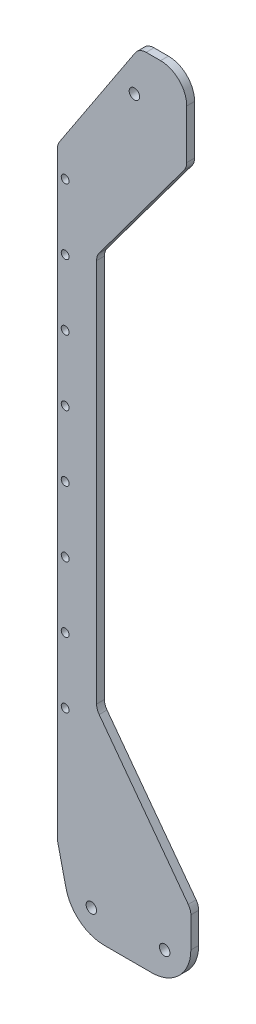
ISO-10303-21;
HEADER;
FILE_DESCRIPTION(('STEP AP214'),'2;1');
FILE_NAME('part.step','',(''),(''),'','','');
FILE_SCHEMA(('AUTOMOTIVE_DESIGN { 1 0 10303 214 1 1 1 1 }'));
ENDSEC;
DATA;
#1=APPLICATION_CONTEXT('core data for automotive mechanical design processes');
#2=APPLICATION_PROTOCOL_DEFINITION('international standard','automotive_design',2000,#1);
#3=PRODUCT_CONTEXT('',#1,'mechanical');
#4=PRODUCT('Part','Part','',(#3));
#5=PRODUCT_RELATED_PRODUCT_CATEGORY('part','',(#4));
#6=PRODUCT_DEFINITION_FORMATION('','',#4);
#7=PRODUCT_DEFINITION_CONTEXT('part definition',#1,'design');
#8=PRODUCT_DEFINITION('design','',#6,#7);
#9=PRODUCT_DEFINITION_SHAPE('','',#8);
#10=(LENGTH_UNIT() NAMED_UNIT(*) SI_UNIT(.MILLI.,.METRE.));
#11=(NAMED_UNIT(*) PLANE_ANGLE_UNIT() SI_UNIT($,.RADIAN.));
#12=(NAMED_UNIT(*) SI_UNIT($,.STERADIAN.) SOLID_ANGLE_UNIT());
#13=UNCERTAINTY_MEASURE_WITH_UNIT(LENGTH_MEASURE(1.E-05),#10,'distance_accuracy_value','');
#14=(GEOMETRIC_REPRESENTATION_CONTEXT(3) GLOBAL_UNCERTAINTY_ASSIGNED_CONTEXT((#13)) GLOBAL_UNIT_ASSIGNED_CONTEXT((#10,
#11,#12)) REPRESENTATION_CONTEXT('',''));
#15=CARTESIAN_POINT('',(0.,0.,0.));
#16=DIRECTION('',(0.,0.,1.));
#17=DIRECTION('',(1.,0.,0.));
#18=AXIS2_PLACEMENT_3D('',#15,#16,#17);
#19=CARTESIAN_POINT('',(0.,0.,3.));
#20=DIRECTION('',(0.,0.,1.));
#21=DIRECTION('',(1.,0.,0.));
#22=AXIS2_PLACEMENT_3D('',#19,#20,#21);
#23=PLANE('',#22);
#24=CARTESIAN_POINT('',(-12.,246.,3.));
#25=DIRECTION('',(0.,0.,1.));
#26=DIRECTION('',(1.,0.,0.));
#27=AXIS2_PLACEMENT_3D('',#24,#25,#26);
#28=CIRCLE('',#27,1.5);
#29=CARTESIAN_POINT('',(-10.5,246.,3.));
#30=VERTEX_POINT('',#29);
#31=EDGE_CURVE('E728',#30,#30,#28,.T.);
#32=ORIENTED_EDGE('',*,*,#31,.F.);
#33=EDGE_LOOP('',(#32));
#34=FACE_BOUND('',#33,.T.);
#35=CARTESIAN_POINT('',(-12.,221.,3.));
#36=DIRECTION('',(0.,0.,1.));
#37=DIRECTION('',(1.,0.,0.));
#38=AXIS2_PLACEMENT_3D('',#35,#36,#37);
#39=CIRCLE('',#38,1.5);
#40=CARTESIAN_POINT('',(-10.5,221.,3.));
#41=VERTEX_POINT('',#40);
#42=EDGE_CURVE('E775',#41,#41,#39,.T.);
#43=ORIENTED_EDGE('',*,*,#42,.F.);
#44=EDGE_LOOP('',(#43));
#45=FACE_BOUND('',#44,.T.);
#46=CARTESIAN_POINT('',(-12.,196.,3.));
#47=DIRECTION('',(0.,0.,1.));
#48=DIRECTION('',(1.,0.,0.));
#49=AXIS2_PLACEMENT_3D('',#46,#47,#48);
#50=CIRCLE('',#49,1.5);
#51=CARTESIAN_POINT('',(-10.5,196.,3.));
#52=VERTEX_POINT('',#51);
#53=EDGE_CURVE('E766',#52,#52,#50,.T.);
#54=ORIENTED_EDGE('',*,*,#53,.F.);
#55=EDGE_LOOP('',(#54));
#56=FACE_BOUND('',#55,.T.);
#57=CARTESIAN_POINT('',(-12.,171.,3.));
#58=DIRECTION('',(0.,0.,1.));
#59=DIRECTION('',(1.,0.,0.));
#60=AXIS2_PLACEMENT_3D('',#57,#58,#59);
#61=CIRCLE('',#60,1.5);
#62=CARTESIAN_POINT('',(-10.5,171.,3.));
#63=VERTEX_POINT('',#62);
#64=EDGE_CURVE('E759',#63,#63,#61,.T.);
#65=ORIENTED_EDGE('',*,*,#64,.F.);
#66=EDGE_LOOP('',(#65));
#67=FACE_BOUND('',#66,.T.);
#68=CARTESIAN_POINT('',(-12.,146.,3.));
#69=DIRECTION('',(0.,0.,1.));
#70=DIRECTION('',(1.,0.,0.));
#71=AXIS2_PLACEMENT_3D('',#68,#69,#70);
#72=CIRCLE('',#71,1.5);
#73=CARTESIAN_POINT('',(-10.5,146.,3.));
#74=VERTEX_POINT('',#73);
#75=EDGE_CURVE('E754',#74,#74,#72,.T.);
#76=ORIENTED_EDGE('',*,*,#75,.F.);
#77=EDGE_LOOP('',(#76));
#78=FACE_BOUND('',#77,.T.);
#79=CARTESIAN_POINT('',(-12.,121.,3.));
#80=DIRECTION('',(0.,0.,1.));
#81=DIRECTION('',(1.,0.,0.));
#82=AXIS2_PLACEMENT_3D('',#79,#80,#81);
#83=CIRCLE('',#82,1.5);
#84=CARTESIAN_POINT('',(-10.5,121.,3.));
#85=VERTEX_POINT('',#84);
#86=EDGE_CURVE('E746',#85,#85,#83,.T.);
#87=ORIENTED_EDGE('',*,*,#86,.F.);
#88=EDGE_LOOP('',(#87));
#89=FACE_BOUND('',#88,.T.);
#90=CARTESIAN_POINT('',(-12.,96.,3.));
#91=DIRECTION('',(0.,0.,1.));
#92=DIRECTION('',(1.,0.,0.));
#93=AXIS2_PLACEMENT_3D('',#90,#91,#92);
#94=CIRCLE('',#93,1.5);
#95=CARTESIAN_POINT('',(-10.5,96.,3.));
#96=VERTEX_POINT('',#95);
#97=EDGE_CURVE('E745',#96,#96,#94,.T.);
#98=ORIENTED_EDGE('',*,*,#97,.F.);
#99=EDGE_LOOP('',(#98));
#100=FACE_BOUND('',#99,.T.);
#101=CARTESIAN_POINT('',(-12.,71.,3.));
#102=DIRECTION('',(0.,0.,1.));
#103=DIRECTION('',(1.,0.,0.));
#104=AXIS2_PLACEMENT_3D('',#101,#102,#103);
#105=CIRCLE('',#104,1.5);
#106=CARTESIAN_POINT('',(-10.5,71.,3.));
#107=VERTEX_POINT('',#106);
#108=EDGE_CURVE('E738',#107,#107,#105,.T.);
#109=ORIENTED_EDGE('',*,*,#108,.F.);
#110=EDGE_LOOP('',(#109));
#111=FACE_BOUND('',#110,.T.);
#112=CARTESIAN_POINT('',(14.4368280116076,287.4052901571,3.));
#113=DIRECTION('',(0.,0.,1.));
#114=DIRECTION('',(-1.,0.,0.));
#115=AXIS2_PLACEMENT_3D('',#112,#113,#114);
#116=CIRCLE('',#115,2.00000000000004);
#117=CARTESIAN_POINT('',(12.4368280116075,287.4052901571,3.));
#118=VERTEX_POINT('',#117);
#119=EDGE_CURVE('E468',#118,#118,#116,.T.);
#120=ORIENTED_EDGE('',*,*,#119,.F.);
#121=EDGE_LOOP('',(#120));
#122=FACE_BOUND('',#121,.T.);
#123=DIRECTION('',(0.,1.,0.));
#124=VECTOR('',#123,1.);
#125=CARTESIAN_POINT('',(34.4368280116076,273.032399522689,3.));
#126=LINE('',#125,#124);
#127=CARTESIAN_POINT('',(34.4368280116076,274.687122239053,3.));
#128=VERTEX_POINT('',#127);
#129=CARTESIAN_POINT('',(34.4368280116076,293.4052901571,3.));
#130=VERTEX_POINT('',#129);
#131=EDGE_CURVE('E339',#128,#130,#126,.T.);
#132=ORIENTED_EDGE('',*,*,#131,.T.);
#133=CARTESIAN_POINT('',(24.4368280116076,293.4052901571,3.));
#134=DIRECTION('',(0.,0.,1.));
#135=DIRECTION('',(1.,0.,0.));
#136=AXIS2_PLACEMENT_3D('',#133,#134,#135);
#137=CIRCLE('',#136,10.);
#138=CARTESIAN_POINT('',(24.4368280116076,303.4052901571,3.));
#139=VERTEX_POINT('',#138);
#140=EDGE_CURVE('E11',#130,#139,#137,.T.);
#141=ORIENTED_EDGE('',*,*,#140,.T.);
#142=DIRECTION('',(-1.,0.,0.));
#143=VECTOR('',#142,1.);
#144=CARTESIAN_POINT('',(34.4368280116076,303.4052901571,3.));
#145=LINE('',#144,#143);
#146=CARTESIAN_POINT('',(18.9256887557333,303.4052901571,3.));
#147=VERTEX_POINT('',#146);
#148=EDGE_CURVE('E320',#139,#147,#145,.T.);
#149=ORIENTED_EDGE('',*,*,#148,.T.);
#150=CARTESIAN_POINT('',(18.9256887557333,298.4052901571,3.));
#151=DIRECTION('',(0.,0.,1.));
#152=DIRECTION('',(1.,0.,0.));
#153=AXIS2_PLACEMENT_3D('',#150,#151,#152);
#154=CIRCLE('',#153,5.);
#155=CARTESIAN_POINT('',(14.7504059798159,301.156110714884,3.));
#156=VERTEX_POINT('',#155);
#157=EDGE_CURVE('E268',#147,#156,#154,.T.);
#158=ORIENTED_EDGE('',*,*,#157,.T.);
#159=DIRECTION('',(-0.550164111556811,-0.835056555183483,0.));
#160=VECTOR('',#159,1.);
#161=CARTESIAN_POINT('',(16.2322431103402,303.4052901571,3.));
#162=LINE('',#161,#160);
#163=CARTESIAN_POINT('',(-14.1752827759174,257.251781985913,3.));
#164=VERTEX_POINT('',#163);
#165=EDGE_CURVE('E327',#156,#164,#162,.T.);
#166=ORIENTED_EDGE('',*,*,#165,.T.);
#167=CARTESIAN_POINT('',(-10.,254.500961428129,3.));
#168=DIRECTION('',(0.,0.,1.));
#169=DIRECTION('',(1.,0.,0.));
#170=AXIS2_PLACEMENT_3D('',#167,#168,#169);
#171=CIRCLE('',#170,5.);
#172=CARTESIAN_POINT('',(-15.,254.500961428129,3.));
#173=VERTEX_POINT('',#172);
#174=EDGE_CURVE('E266',#164,#173,#171,.T.);
#175=ORIENTED_EDGE('',*,*,#174,.T.);
#176=DIRECTION('',(0.,-1.,0.));
#177=VECTOR('',#176,1.);
#178=CARTESIAN_POINT('',(-15.,256.,3.));
#179=LINE('',#178,#177);
#180=CARTESIAN_POINT('',(-15.0000000000001,26.5694401068772,3.));
#181=VERTEX_POINT('',#180);
#182=EDGE_CURVE('E331',#173,#181,#179,.T.);
#183=ORIENTED_EDGE('',*,*,#182,.T.);
#184=CARTESIAN_POINT('',(-10.0000000000001,26.5694401068772,3.));
#185=DIRECTION('',(0.,0.,1.));
#186=DIRECTION('',(1.,0.,0.));
#187=AXIS2_PLACEMENT_3D('',#184,#185,#186);
#188=CIRCLE('',#187,5.);
#189=CARTESIAN_POINT('',(-14.8719559784732,25.4451425733834,3.));
#190=VERTEX_POINT('',#189);
#191=EDGE_CURVE('E275',#181,#190,#188,.T.);
#192=ORIENTED_EDGE('',*,*,#191,.T.);
#193=DIRECTION('',(0.224859506698758,-0.97439119569462,0.));
#194=VECTOR('',#193,1.);
#195=CARTESIAN_POINT('',(-15.0000000000001,26.,3.));
#196=LINE('',#195,#194);
#197=CARTESIAN_POINT('',(-11.6831786306582,11.6271073995186,3.));
#198=VERTEX_POINT('',#197);
#199=EDGE_CURVE('E197',#190,#198,#196,.T.);
#200=ORIENTED_EDGE('',*,*,#199,.T.);
#201=CARTESIAN_POINT('',(2.93268930476107,15.,3.));
#202=DIRECTION('',(0.,0.,1.));
#203=DIRECTION('',(1.,0.,0.));
#204=AXIS2_PLACEMENT_3D('',#201,#202,#203);
#205=CIRCLE('',#204,15.);
#206=CARTESIAN_POINT('',(2.93268930476107,0.,3.));
#207=VERTEX_POINT('',#206);
#208=EDGE_CURVE('E237',#198,#207,#205,.T.);
#209=ORIENTED_EDGE('',*,*,#208,.T.);
#210=DIRECTION('',(1.,0.,0.));
#211=VECTOR('',#210,1.);
#212=CARTESIAN_POINT('',(-9.00000000000008,0.,3.));
#213=LINE('',#212,#211);
#214=CARTESIAN_POINT('',(21.,0.,3.));
#215=VERTEX_POINT('',#214);
#216=EDGE_CURVE('E235',#207,#215,#213,.T.);
#217=ORIENTED_EDGE('',*,*,#216,.T.);
#218=CARTESIAN_POINT('',(21.,15.,3.));
#219=DIRECTION('',(0.,0.,1.));
#220=DIRECTION('',(1.,0.,0.));
#221=AXIS2_PLACEMENT_3D('',#218,#219,#220);
#222=CIRCLE('',#221,15.);
#223=CARTESIAN_POINT('',(36.,15.,3.));
#224=VERTEX_POINT('',#223);
#225=EDGE_CURVE('E241',#215,#224,#222,.T.);
#226=ORIENTED_EDGE('',*,*,#225,.T.);
#227=DIRECTION('',(0.,1.,0.));
#228=VECTOR('',#227,1.);
#229=CARTESIAN_POINT('',(36.,0.,3.));
#230=LINE('',#229,#228);
#231=CARTESIAN_POINT('',(36.,26.6151468630369,3.));
#232=VERTEX_POINT('',#231);
#233=EDGE_CURVE('E199',#224,#232,#230,.T.);
#234=ORIENTED_EDGE('',*,*,#233,.T.);
#235=CARTESIAN_POINT('',(31.,26.6151468630369,3.));
#236=DIRECTION('',(0.,0.,1.));
#237=DIRECTION('',(1.,0.,0.));
#238=AXIS2_PLACEMENT_3D('',#235,#236,#237);
#239=CIRCLE('',#238,5.);
#240=CARTESIAN_POINT('',(35.0128716276162,29.5979075474152,3.));
#241=VERTEX_POINT('',#240);
#242=EDGE_CURVE('E264',#232,#241,#239,.T.);
#243=ORIENTED_EDGE('',*,*,#242,.T.);
#244=DIRECTION('',(-0.596552136875664,0.802574325523237,0.));
#245=VECTOR('',#244,1.);
#246=CARTESIAN_POINT('',(36.,28.2698695794012,3.));
#247=LINE('',#246,#245);
#248=CARTESIAN_POINT('',(0.987128372383808,75.374607110536,3.));
#249=VERTEX_POINT('',#248);
#250=EDGE_CURVE('E489',#241,#249,#247,.T.);
#251=ORIENTED_EDGE('',*,*,#250,.T.);
#252=CARTESIAN_POINT('',(5.,78.3573677949143,3.));
#253=DIRECTION('',(0.,0.,1.));
#254=DIRECTION('',(1.,0.,0.));
#255=AXIS2_PLACEMENT_3D('',#252,#253,#254);
#256=CIRCLE('',#255,5.);
#257=CARTESIAN_POINT('',(0.,78.3573677949143,3.));
#258=VERTEX_POINT('',#257);
#259=EDGE_CURVE('E308',#249,#258,#256,.F.);
#260=ORIENTED_EDGE('',*,*,#259,.T.);
#261=DIRECTION('',(0.,1.,0.));
#262=VECTOR('',#261,1.);
#263=CARTESIAN_POINT('',(0.,76.70264507855,3.));
#264=LINE('',#263,#262);
#265=CARTESIAN_POINT('',(0.,225.047922362186,3.));
#266=VERTEX_POINT('',#265);
#267=EDGE_CURVE('E491',#258,#266,#264,.T.);
#268=ORIENTED_EDGE('',*,*,#267,.T.);
#269=CARTESIAN_POINT('',(5.,225.047922362186,3.));
#270=DIRECTION('',(0.,0.,1.));
#271=DIRECTION('',(1.,0.,0.));
#272=AXIS2_PLACEMENT_3D('',#269,#270,#271);
#273=CIRCLE('',#272,5.);
#274=CARTESIAN_POINT('',(0.987128372383809,228.030683046564,3.));
#275=VERTEX_POINT('',#274);
#276=EDGE_CURVE('E302',#266,#275,#273,.F.);
#277=ORIENTED_EDGE('',*,*,#276,.T.);
#278=DIRECTION('',(0.596552136875664,0.802574325523237,0.));
#279=VECTOR('',#278,1.);
#280=CARTESIAN_POINT('',(0.,226.70264507855,3.));
#281=LINE('',#280,#279);
#282=CARTESIAN_POINT('',(33.4496996392238,271.704361554675,3.));
#283=VERTEX_POINT('',#282);
#284=EDGE_CURVE('E496',#275,#283,#281,.T.);
#285=ORIENTED_EDGE('',*,*,#284,.T.);
#286=CARTESIAN_POINT('',(29.4368280116076,274.687122239053,3.));
#287=DIRECTION('',(0.,0.,1.));
#288=DIRECTION('',(1.,0.,0.));
#289=AXIS2_PLACEMENT_3D('',#286,#287,#288);
#290=CIRCLE('',#289,5.);
#291=EDGE_CURVE('E267',#283,#128,#290,.T.);
#292=ORIENTED_EDGE('',*,*,#291,.T.);
#293=EDGE_LOOP('',(#132,#141,#149,#158,#166,#175,#183,#192,#200,#209,#217,#226,#234,#243,#251,
#260,#268,#277,#285,#292));
#294=FACE_BOUND('',#293,.T.);
#295=CARTESIAN_POINT('',(26.,10.,3.));
#296=DIRECTION('',(0.,0.,1.));
#297=DIRECTION('',(1.,0.,0.));
#298=AXIS2_PLACEMENT_3D('',#295,#296,#297);
#299=CIRCLE('',#298,2.);
#300=CARTESIAN_POINT('',(28.,10.,3.));
#301=VERTEX_POINT('',#300);
#302=EDGE_CURVE('E215',#301,#301,#299,.T.);
#303=ORIENTED_EDGE('',*,*,#302,.F.);
#304=EDGE_LOOP('',(#303));
#305=FACE_BOUND('',#304,.T.);
#306=CARTESIAN_POINT('',(-2.00000000000008,10.,3.));
#307=DIRECTION('',(0.,0.,1.));
#308=DIRECTION('',(1.,0.,0.));
#309=AXIS2_PLACEMENT_3D('',#306,#307,#308);
#310=CIRCLE('',#309,2.);
#311=CARTESIAN_POINT('',(0.,10.,3.));
#312=VERTEX_POINT('',#311);
#313=EDGE_CURVE('E474',#312,#312,#310,.T.);
#314=ORIENTED_EDGE('',*,*,#313,.F.);
#315=EDGE_LOOP('',(#314));
#316=FACE_BOUND('',#315,.T.);
#317=ADVANCED_FACE('F43',(#34,#45,#56,#67,#78,#89,#100,#111,#122,#294,#305,#316),#23,.T.);
#318=CARTESIAN_POINT('',(0.,0.,0.));
#319=DIRECTION('',(0.,0.,1.));
#320=DIRECTION('',(1.,0.,0.));
#321=AXIS2_PLACEMENT_3D('',#318,#319,#320);
#322=PLANE('',#321);
#323=CARTESIAN_POINT('',(-12.,246.,0.));
#324=DIRECTION('',(0.,0.,1.));
#325=DIRECTION('',(1.,0.,0.));
#326=AXIS2_PLACEMENT_3D('',#323,#324,#325);
#327=CIRCLE('',#326,1.5);
#328=CARTESIAN_POINT('',(-10.5,246.,0.));
#329=VERTEX_POINT('',#328);
#330=EDGE_CURVE('E726',#329,#329,#327,.T.);
#331=ORIENTED_EDGE('',*,*,#330,.T.);
#332=EDGE_LOOP('',(#331));
#333=FACE_BOUND('',#332,.T.);
#334=CARTESIAN_POINT('',(-12.,221.,0.));
#335=DIRECTION('',(0.,0.,1.));
#336=DIRECTION('',(1.,0.,0.));
#337=AXIS2_PLACEMENT_3D('',#334,#335,#336);
#338=CIRCLE('',#337,1.5);
#339=CARTESIAN_POINT('',(-10.5,221.,0.));
#340=VERTEX_POINT('',#339);
#341=EDGE_CURVE('E768',#340,#340,#338,.T.);
#342=ORIENTED_EDGE('',*,*,#341,.T.);
#343=EDGE_LOOP('',(#342));
#344=FACE_BOUND('',#343,.T.);
#345=CARTESIAN_POINT('',(-12.,196.,0.));
#346=DIRECTION('',(0.,0.,1.));
#347=DIRECTION('',(1.,0.,0.));
#348=AXIS2_PLACEMENT_3D('',#345,#346,#347);
#349=CIRCLE('',#348,1.5);
#350=CARTESIAN_POINT('',(-10.5,196.,0.));
#351=VERTEX_POINT('',#350);
#352=EDGE_CURVE('E763',#351,#351,#349,.T.);
#353=ORIENTED_EDGE('',*,*,#352,.T.);
#354=EDGE_LOOP('',(#353));
#355=FACE_BOUND('',#354,.T.);
#356=CARTESIAN_POINT('',(-12.,171.,0.));
#357=DIRECTION('',(0.,0.,1.));
#358=DIRECTION('',(1.,0.,0.));
#359=AXIS2_PLACEMENT_3D('',#356,#357,#358);
#360=CIRCLE('',#359,1.5);
#361=CARTESIAN_POINT('',(-10.5,171.,0.));
#362=VERTEX_POINT('',#361);
#363=EDGE_CURVE('E760',#362,#362,#360,.T.);
#364=ORIENTED_EDGE('',*,*,#363,.T.);
#365=EDGE_LOOP('',(#364));
#366=FACE_BOUND('',#365,.T.);
#367=CARTESIAN_POINT('',(-12.,146.,0.));
#368=DIRECTION('',(0.,0.,1.));
#369=DIRECTION('',(1.,0.,0.));
#370=AXIS2_PLACEMENT_3D('',#367,#368,#369);
#371=CIRCLE('',#370,1.5);
#372=CARTESIAN_POINT('',(-10.5,146.,0.));
#373=VERTEX_POINT('',#372);
#374=EDGE_CURVE('E753',#373,#373,#371,.T.);
#375=ORIENTED_EDGE('',*,*,#374,.T.);
#376=EDGE_LOOP('',(#375));
#377=FACE_BOUND('',#376,.T.);
#378=CARTESIAN_POINT('',(-12.,121.,0.));
#379=DIRECTION('',(0.,0.,1.));
#380=DIRECTION('',(1.,0.,0.));
#381=AXIS2_PLACEMENT_3D('',#378,#379,#380);
#382=CIRCLE('',#381,1.5);
#383=CARTESIAN_POINT('',(-10.5,121.,0.));
#384=VERTEX_POINT('',#383);
#385=EDGE_CURVE('E741',#384,#384,#382,.T.);
#386=ORIENTED_EDGE('',*,*,#385,.T.);
#387=EDGE_LOOP('',(#386));
#388=FACE_BOUND('',#387,.T.);
#389=CARTESIAN_POINT('',(-12.,96.,0.));
#390=DIRECTION('',(0.,0.,1.));
#391=DIRECTION('',(1.,0.,0.));
#392=AXIS2_PLACEMENT_3D('',#389,#390,#391);
#393=CIRCLE('',#392,1.5);
#394=CARTESIAN_POINT('',(-10.5,96.,0.));
#395=VERTEX_POINT('',#394);
#396=EDGE_CURVE('E739',#395,#395,#393,.T.);
#397=ORIENTED_EDGE('',*,*,#396,.T.);
#398=EDGE_LOOP('',(#397));
#399=FACE_BOUND('',#398,.T.);
#400=CARTESIAN_POINT('',(-12.,71.,0.));
#401=DIRECTION('',(0.,0.,1.));
#402=DIRECTION('',(1.,0.,0.));
#403=AXIS2_PLACEMENT_3D('',#400,#401,#402);
#404=CIRCLE('',#403,1.5);
#405=CARTESIAN_POINT('',(-10.5,71.,0.));
#406=VERTEX_POINT('',#405);
#407=EDGE_CURVE('E732',#406,#406,#404,.T.);
#408=ORIENTED_EDGE('',*,*,#407,.T.);
#409=EDGE_LOOP('',(#408));
#410=FACE_BOUND('',#409,.T.);
#411=DIRECTION('',(-1.,0.,0.));
#412=VECTOR('',#411,1.);
#413=CARTESIAN_POINT('',(34.4368280116076,303.4052901571,0.));
#414=LINE('',#413,#412);
#415=CARTESIAN_POINT('',(24.4368280116076,303.4052901571,0.));
#416=VERTEX_POINT('',#415);
#417=CARTESIAN_POINT('',(18.9256887557333,303.4052901571,0.));
#418=VERTEX_POINT('',#417);
#419=EDGE_CURVE('E223',#416,#418,#414,.T.);
#420=ORIENTED_EDGE('',*,*,#419,.F.);
#421=CARTESIAN_POINT('',(24.4368280116076,293.4052901571,0.));
#422=DIRECTION('',(0.,0.,1.));
#423=DIRECTION('',(1.,0.,0.));
#424=AXIS2_PLACEMENT_3D('',#421,#422,#423);
#425=CIRCLE('',#424,10.);
#426=CARTESIAN_POINT('',(34.4368280116076,293.4052901571,0.));
#427=VERTEX_POINT('',#426);
#428=EDGE_CURVE('E64',#416,#427,#425,.F.);
#429=ORIENTED_EDGE('',*,*,#428,.T.);
#430=DIRECTION('',(0.,1.,0.));
#431=VECTOR('',#430,1.);
#432=CARTESIAN_POINT('',(34.4368280116076,273.032399522689,0.));
#433=LINE('',#432,#431);
#434=CARTESIAN_POINT('',(34.4368280116076,274.687122239053,0.));
#435=VERTEX_POINT('',#434);
#436=EDGE_CURVE('E222',#435,#427,#433,.T.);
#437=ORIENTED_EDGE('',*,*,#436,.F.);
#438=CARTESIAN_POINT('',(29.4368280116076,274.687122239053,0.));
#439=DIRECTION('',(0.,0.,1.));
#440=DIRECTION('',(1.,0.,0.));
#441=AXIS2_PLACEMENT_3D('',#438,#439,#440);
#442=CIRCLE('',#441,5.);
#443=CARTESIAN_POINT('',(33.4496996392238,271.704361554675,0.));
#444=VERTEX_POINT('',#443);
#445=EDGE_CURVE('E249',#435,#444,#442,.F.);
#446=ORIENTED_EDGE('',*,*,#445,.T.);
#447=DIRECTION('',(0.596552136875664,0.802574325523237,0.));
#448=VECTOR('',#447,1.);
#449=CARTESIAN_POINT('',(0.,226.70264507855,0.));
#450=LINE('',#449,#448);
#451=CARTESIAN_POINT('',(0.987128372383809,228.030683046564,0.));
#452=VERTEX_POINT('',#451);
#453=EDGE_CURVE('E216',#452,#444,#450,.T.);
#454=ORIENTED_EDGE('',*,*,#453,.F.);
#455=CARTESIAN_POINT('',(5.,225.047922362186,0.));
#456=DIRECTION('',(0.,0.,1.));
#457=DIRECTION('',(1.,0.,0.));
#458=AXIS2_PLACEMENT_3D('',#455,#456,#457);
#459=CIRCLE('',#458,5.);
#460=CARTESIAN_POINT('',(0.,225.047922362186,0.));
#461=VERTEX_POINT('',#460);
#462=EDGE_CURVE('E305',#452,#461,#459,.T.);
#463=ORIENTED_EDGE('',*,*,#462,.T.);
#464=DIRECTION('',(0.,1.,0.));
#465=VECTOR('',#464,1.);
#466=CARTESIAN_POINT('',(0.,76.70264507855,0.));
#467=LINE('',#466,#465);
#468=CARTESIAN_POINT('',(0.,78.3573677949143,0.));
#469=VERTEX_POINT('',#468);
#470=EDGE_CURVE('E208',#469,#461,#467,.T.);
#471=ORIENTED_EDGE('',*,*,#470,.F.);
#472=CARTESIAN_POINT('',(5.,78.3573677949143,0.));
#473=DIRECTION('',(0.,0.,1.));
#474=DIRECTION('',(1.,0.,0.));
#475=AXIS2_PLACEMENT_3D('',#472,#473,#474);
#476=CIRCLE('',#475,5.);
#477=CARTESIAN_POINT('',(0.987128372383808,75.374607110536,0.));
#478=VERTEX_POINT('',#477);
#479=EDGE_CURVE('E306',#469,#478,#476,.T.);
#480=ORIENTED_EDGE('',*,*,#479,.T.);
#481=DIRECTION('',(-0.596552136875664,0.802574325523237,0.));
#482=VECTOR('',#481,1.);
#483=CARTESIAN_POINT('',(36.,28.2698695794012,0.));
#484=LINE('',#483,#482);
#485=CARTESIAN_POINT('',(35.0128716276162,29.5979075474152,0.));
#486=VERTEX_POINT('',#485);
#487=EDGE_CURVE('E207',#486,#478,#484,.T.);
#488=ORIENTED_EDGE('',*,*,#487,.F.);
#489=CARTESIAN_POINT('',(31.,26.6151468630369,0.));
#490=DIRECTION('',(0.,0.,1.));
#491=DIRECTION('',(1.,0.,0.));
#492=AXIS2_PLACEMENT_3D('',#489,#490,#491);
#493=CIRCLE('',#492,5.);
#494=CARTESIAN_POINT('',(36.,26.6151468630369,0.));
#495=VERTEX_POINT('',#494);
#496=EDGE_CURVE('E201',#486,#495,#493,.F.);
#497=ORIENTED_EDGE('',*,*,#496,.T.);
#498=DIRECTION('',(0.,1.,0.));
#499=VECTOR('',#498,1.);
#500=CARTESIAN_POINT('',(36.,0.,0.));
#501=LINE('',#500,#499);
#502=CARTESIAN_POINT('',(36.,15.,0.));
#503=VERTEX_POINT('',#502);
#504=EDGE_CURVE('E198',#503,#495,#501,.T.);
#505=ORIENTED_EDGE('',*,*,#504,.F.);
#506=CARTESIAN_POINT('',(21.,15.,0.));
#507=DIRECTION('',(0.,0.,1.));
#508=DIRECTION('',(1.,0.,0.));
#509=AXIS2_PLACEMENT_3D('',#506,#507,#508);
#510=CIRCLE('',#509,15.);
#511=CARTESIAN_POINT('',(21.,0.,0.));
#512=VERTEX_POINT('',#511);
#513=EDGE_CURVE('E179',#503,#512,#510,.F.);
#514=ORIENTED_EDGE('',*,*,#513,.T.);
#515=DIRECTION('',(1.,0.,0.));
#516=VECTOR('',#515,1.);
#517=CARTESIAN_POINT('',(0.,0.,0.));
#518=LINE('',#517,#516);
#519=CARTESIAN_POINT('',(2.93268930476107,0.,0.));
#520=VERTEX_POINT('',#519);
#521=EDGE_CURVE('E210',#520,#512,#518,.T.);
#522=ORIENTED_EDGE('',*,*,#521,.F.);
#523=CARTESIAN_POINT('',(2.93268930476107,15.,0.));
#524=DIRECTION('',(0.,0.,1.));
#525=DIRECTION('',(1.,0.,0.));
#526=AXIS2_PLACEMENT_3D('',#523,#524,#525);
#527=CIRCLE('',#526,15.);
#528=CARTESIAN_POINT('',(-11.6831786306582,11.6271073995186,0.));
#529=VERTEX_POINT('',#528);
#530=EDGE_CURVE('E188',#520,#529,#527,.F.);
#531=ORIENTED_EDGE('',*,*,#530,.T.);
#532=DIRECTION('',(0.224859506698758,-0.97439119569462,0.));
#533=VECTOR('',#532,1.);
#534=CARTESIAN_POINT('',(-15.0000000000001,26.,0.));
#535=LINE('',#534,#533);
#536=CARTESIAN_POINT('',(-14.8719559784732,25.4451425733834,0.));
#537=VERTEX_POINT('',#536);
#538=EDGE_CURVE('E233',#537,#529,#535,.T.);
#539=ORIENTED_EDGE('',*,*,#538,.F.);
#540=CARTESIAN_POINT('',(-10.0000000000001,26.5694401068772,0.));
#541=DIRECTION('',(0.,0.,1.));
#542=DIRECTION('',(1.,0.,0.));
#543=AXIS2_PLACEMENT_3D('',#540,#541,#542);
#544=CIRCLE('',#543,5.);
#545=CARTESIAN_POINT('',(-15.0000000000001,26.5694401068772,0.));
#546=VERTEX_POINT('',#545);
#547=EDGE_CURVE('E260',#537,#546,#544,.F.);
#548=ORIENTED_EDGE('',*,*,#547,.T.);
#549=DIRECTION('',(0.,-1.,0.));
#550=VECTOR('',#549,1.);
#551=CARTESIAN_POINT('',(-15.,256.,0.));
#552=LINE('',#551,#550);
#553=CARTESIAN_POINT('',(-15.,254.500961428129,0.));
#554=VERTEX_POINT('',#553);
#555=EDGE_CURVE('E226',#554,#546,#552,.T.);
#556=ORIENTED_EDGE('',*,*,#555,.F.);
#557=CARTESIAN_POINT('',(-10.,254.500961428129,0.));
#558=DIRECTION('',(0.,0.,1.));
#559=DIRECTION('',(1.,0.,0.));
#560=AXIS2_PLACEMENT_3D('',#557,#558,#559);
#561=CIRCLE('',#560,5.);
#562=CARTESIAN_POINT('',(-14.1752827759174,257.251781985913,0.));
#563=VERTEX_POINT('',#562);
#564=EDGE_CURVE('E253',#554,#563,#561,.F.);
#565=ORIENTED_EDGE('',*,*,#564,.T.);
#566=DIRECTION('',(-0.550164111556811,-0.835056555183483,0.));
#567=VECTOR('',#566,1.);
#568=CARTESIAN_POINT('',(16.2322431103402,303.4052901571,0.));
#569=LINE('',#568,#567);
#570=CARTESIAN_POINT('',(14.7504059798159,301.156110714884,0.));
#571=VERTEX_POINT('',#570);
#572=EDGE_CURVE('E221',#571,#563,#569,.T.);
#573=ORIENTED_EDGE('',*,*,#572,.F.);
#574=CARTESIAN_POINT('',(18.9256887557333,298.4052901571,0.));
#575=DIRECTION('',(0.,0.,1.));
#576=DIRECTION('',(1.,0.,0.));
#577=AXIS2_PLACEMENT_3D('',#574,#575,#576);
#578=CIRCLE('',#577,5.);
#579=EDGE_CURVE('E255',#571,#418,#578,.F.);
#580=ORIENTED_EDGE('',*,*,#579,.T.);
#581=EDGE_LOOP('',(#420,#429,#437,#446,#454,#463,#471,#480,#488,#497,#505,#514,#522,#531,#539,
#548,#556,#565,#573,#580));
#582=FACE_BOUND('',#581,.T.);
#583=CARTESIAN_POINT('',(26.,10.,0.));
#584=DIRECTION('',(0.,0.,1.));
#585=DIRECTION('',(1.,0.,0.));
#586=AXIS2_PLACEMENT_3D('',#583,#584,#585);
#587=CIRCLE('',#586,2.);
#588=CARTESIAN_POINT('',(28.,10.,0.));
#589=VERTEX_POINT('',#588);
#590=EDGE_CURVE('E480',#589,#589,#587,.T.);
#591=ORIENTED_EDGE('',*,*,#590,.T.);
#592=EDGE_LOOP('',(#591));
#593=FACE_BOUND('',#592,.T.);
#594=CARTESIAN_POINT('',(14.4368280116076,287.4052901571,0.));
#595=DIRECTION('',(0.,0.,1.));
#596=DIRECTION('',(-1.,0.,0.));
#597=AXIS2_PLACEMENT_3D('',#594,#595,#596);
#598=CIRCLE('',#597,2.00000000000004);
#599=CARTESIAN_POINT('',(12.4368280116075,287.4052901571,0.));
#600=VERTEX_POINT('',#599);
#601=EDGE_CURVE('E472',#600,#600,#598,.T.);
#602=ORIENTED_EDGE('',*,*,#601,.T.);
#603=EDGE_LOOP('',(#602));
#604=FACE_BOUND('',#603,.T.);
#605=CARTESIAN_POINT('',(-2.00000000000008,10.,0.));
#606=DIRECTION('',(0.,0.,1.));
#607=DIRECTION('',(1.,0.,0.));
#608=AXIS2_PLACEMENT_3D('',#605,#606,#607);
#609=CIRCLE('',#608,2.);
#610=CARTESIAN_POINT('',(0.,10.,0.));
#611=VERTEX_POINT('',#610);
#612=EDGE_CURVE('E477',#611,#611,#609,.T.);
#613=ORIENTED_EDGE('',*,*,#612,.T.);
#614=EDGE_LOOP('',(#613));
#615=FACE_BOUND('',#614,.T.);
#616=ADVANCED_FACE('F205',(#333,#344,#355,#366,#377,#388,#399,#410,#582,#593,#604,#615),#322,.F.);
#617=CARTESIAN_POINT('',(0.,0.,3.));
#618=DIRECTION('',(0.,1.,0.));
#619=DIRECTION('',(0.,0.,1.));
#620=AXIS2_PLACEMENT_3D('',#617,#618,#619);
#621=PLANE('',#620);
#622=ORIENTED_EDGE('',*,*,#521,.T.);
#623=DIRECTION('',(0.,0.,-1.));
#624=VECTOR('',#623,1.);
#625=CARTESIAN_POINT('',(21.,0.,3.));
#626=LINE('',#625,#624);
#627=EDGE_CURVE('E184',#512,#215,#626,.F.);
#628=ORIENTED_EDGE('',*,*,#627,.T.);
#629=ORIENTED_EDGE('',*,*,#216,.F.);
#630=DIRECTION('',(0.,0.,-1.));
#631=VECTOR('',#630,1.);
#632=CARTESIAN_POINT('',(2.93268930476107,0.,3.));
#633=LINE('',#632,#631);
#634=EDGE_CURVE('E186',#207,#520,#633,.T.);
#635=ORIENTED_EDGE('',*,*,#634,.T.);
#636=EDGE_LOOP('',(#622,#628,#629,#635));
#637=FACE_BOUND('',#636,.T.);
#638=ADVANCED_FACE('F358',(#637),#621,.F.);
#639=CARTESIAN_POINT('',(36.,0.,3.));
#640=DIRECTION('',(-1.,0.,0.));
#641=DIRECTION('',(0.,0.,1.));
#642=AXIS2_PLACEMENT_3D('',#639,#640,#641);
#643=PLANE('',#642);
#644=ORIENTED_EDGE('',*,*,#504,.T.);
#645=DIRECTION('',(0.,0.,-1.));
#646=VECTOR('',#645,1.);
#647=CARTESIAN_POINT('',(36.,26.6151468630369,3.));
#648=LINE('',#647,#646);
#649=EDGE_CURVE('E297',#495,#232,#648,.F.);
#650=ORIENTED_EDGE('',*,*,#649,.T.);
#651=ORIENTED_EDGE('',*,*,#233,.F.);
#652=DIRECTION('',(0.,0.,-1.));
#653=VECTOR('',#652,1.);
#654=CARTESIAN_POINT('',(36.,15.,3.));
#655=LINE('',#654,#653);
#656=EDGE_CURVE('E183',#224,#503,#655,.T.);
#657=ORIENTED_EDGE('',*,*,#656,.T.);
#658=EDGE_LOOP('',(#644,#650,#651,#657));
#659=FACE_BOUND('',#658,.T.);
#660=ADVANCED_FACE('F194',(#659),#643,.F.);
#661=CARTESIAN_POINT('',(36.,28.2698695794012,3.));
#662=DIRECTION('',(-0.802574325523237,-0.596552136875664,0.));
#663=DIRECTION('',(0.596552136875664,-0.802574325523237,0.));
#664=AXIS2_PLACEMENT_3D('',#661,#662,#663);
#665=PLANE('',#664);
#666=ORIENTED_EDGE('',*,*,#487,.T.);
#667=DIRECTION('',(0.,0.,-1.));
#668=VECTOR('',#667,1.);
#669=CARTESIAN_POINT('',(0.987128372383811,75.374607110536,3.));
#670=LINE('',#669,#668);
#671=EDGE_CURVE('E296',#478,#249,#670,.F.);
#672=ORIENTED_EDGE('',*,*,#671,.T.);
#673=ORIENTED_EDGE('',*,*,#250,.F.);
#674=DIRECTION('',(0.,0.,-1.));
#675=VECTOR('',#674,1.);
#676=CARTESIAN_POINT('',(35.0128716276162,29.5979075474152,3.));
#677=LINE('',#676,#675);
#678=EDGE_CURVE('E294',#241,#486,#677,.T.);
#679=ORIENTED_EDGE('',*,*,#678,.T.);
#680=EDGE_LOOP('',(#666,#672,#673,#679));
#681=FACE_BOUND('',#680,.T.);
#682=ADVANCED_FACE('F407',(#681),#665,.F.);
#683=CARTESIAN_POINT('',(0.,76.70264507855,3.));
#684=DIRECTION('',(-1.,0.,0.));
#685=DIRECTION('',(0.,-1.,0.));
#686=AXIS2_PLACEMENT_3D('',#683,#684,#685);
#687=PLANE('',#686);
#688=ORIENTED_EDGE('',*,*,#470,.T.);
#689=DIRECTION('',(0.,0.,-1.));
#690=VECTOR('',#689,1.);
#691=CARTESIAN_POINT('',(0.,225.047922362186,3.));
#692=LINE('',#691,#690);
#693=EDGE_CURVE('E291',#461,#266,#692,.F.);
#694=ORIENTED_EDGE('',*,*,#693,.T.);
#695=ORIENTED_EDGE('',*,*,#267,.F.);
#696=DIRECTION('',(0.,0.,-1.));
#697=VECTOR('',#696,1.);
#698=CARTESIAN_POINT('',(0.,78.3573677949143,0.));
#699=LINE('',#698,#697);
#700=EDGE_CURVE('E286',#258,#469,#699,.T.);
#701=ORIENTED_EDGE('',*,*,#700,.T.);
#702=EDGE_LOOP('',(#688,#694,#695,#701));
#703=FACE_BOUND('',#702,.T.);
#704=ADVANCED_FACE('F404',(#703),#687,.F.);
#705=CARTESIAN_POINT('',(0.,226.70264507855,3.));
#706=DIRECTION('',(-0.802574325523237,0.596552136875664,0.));
#707=DIRECTION('',(-0.596552136875664,-0.802574325523237,0.));
#708=AXIS2_PLACEMENT_3D('',#705,#706,#707);
#709=PLANE('',#708);
#710=ORIENTED_EDGE('',*,*,#453,.T.);
#711=DIRECTION('',(0.,0.,-1.));
#712=VECTOR('',#711,1.);
#713=CARTESIAN_POINT('',(33.4496996392238,271.704361554675,3.));
#714=LINE('',#713,#712);
#715=EDGE_CURVE('E288',#444,#283,#714,.F.);
#716=ORIENTED_EDGE('',*,*,#715,.T.);
#717=ORIENTED_EDGE('',*,*,#284,.F.);
#718=DIRECTION('',(0.,0.,-1.));
#719=VECTOR('',#718,1.);
#720=CARTESIAN_POINT('',(0.987128372383811,228.030683046564,0.));
#721=LINE('',#720,#719);
#722=EDGE_CURVE('E282',#275,#452,#721,.T.);
#723=ORIENTED_EDGE('',*,*,#722,.T.);
#724=EDGE_LOOP('',(#710,#716,#717,#723));
#725=FACE_BOUND('',#724,.T.);
#726=ADVANCED_FACE('F402',(#725),#709,.F.);
#727=CARTESIAN_POINT('',(34.4368280116076,273.032399522689,3.));
#728=DIRECTION('',(-1.,0.,0.));
#729=DIRECTION('',(0.,0.,1.));
#730=AXIS2_PLACEMENT_3D('',#727,#728,#729);
#731=PLANE('',#730);
#732=ORIENTED_EDGE('',*,*,#436,.T.);
#733=DIRECTION('',(0.,0.,-1.));
#734=VECTOR('',#733,1.);
#735=CARTESIAN_POINT('',(34.4368280116076,293.4052901571,3.));
#736=LINE('',#735,#734);
#737=EDGE_CURVE('E51',#427,#130,#736,.F.);
#738=ORIENTED_EDGE('',*,*,#737,.T.);
#739=ORIENTED_EDGE('',*,*,#131,.F.);
#740=DIRECTION('',(0.,0.,-1.));
#741=VECTOR('',#740,1.);
#742=CARTESIAN_POINT('',(34.4368280116076,274.687122239053,3.));
#743=LINE('',#742,#741);
#744=EDGE_CURVE('E285',#128,#435,#743,.T.);
#745=ORIENTED_EDGE('',*,*,#744,.T.);
#746=EDGE_LOOP('',(#732,#738,#739,#745));
#747=FACE_BOUND('',#746,.T.);
#748=ADVANCED_FACE('F398',(#747),#731,.F.);
#749=CARTESIAN_POINT('',(34.4368280116076,303.4052901571,3.));
#750=DIRECTION('',(0.,-1.,0.));
#751=DIRECTION('',(0.,0.,-1.));
#752=AXIS2_PLACEMENT_3D('',#749,#750,#751);
#753=PLANE('',#752);
#754=ORIENTED_EDGE('',*,*,#148,.F.);
#755=DIRECTION('',(0.,0.,-1.));
#756=VECTOR('',#755,1.);
#757=CARTESIAN_POINT('',(24.4368280116076,303.4052901571,3.));
#758=LINE('',#757,#756);
#759=EDGE_CURVE('E309',#139,#416,#758,.T.);
#760=ORIENTED_EDGE('',*,*,#759,.T.);
#761=ORIENTED_EDGE('',*,*,#419,.T.);
#762=DIRECTION('',(0.,0.,-1.));
#763=VECTOR('',#762,1.);
#764=CARTESIAN_POINT('',(18.9256887557333,303.4052901571,3.));
#765=LINE('',#764,#763);
#766=EDGE_CURVE('E278',#418,#147,#765,.F.);
#767=ORIENTED_EDGE('',*,*,#766,.T.);
#768=EDGE_LOOP('',(#754,#760,#761,#767));
#769=FACE_BOUND('',#768,.T.);
#770=ADVANCED_FACE('F317',(#769),#753,.F.);
#771=CARTESIAN_POINT('',(16.2322431103402,303.4052901571,3.));
#772=DIRECTION('',(0.835056555183483,-0.550164111556811,0.));
#773=DIRECTION('',(0.550164111556811,0.835056555183483,0.));
#774=AXIS2_PLACEMENT_3D('',#771,#772,#773);
#775=PLANE('',#774);
#776=ORIENTED_EDGE('',*,*,#572,.T.);
#777=DIRECTION('',(0.,0.,-1.));
#778=VECTOR('',#777,1.);
#779=CARTESIAN_POINT('',(-14.1752827759174,257.251781985913,3.));
#780=LINE('',#779,#778);
#781=EDGE_CURVE('E280',#563,#164,#780,.F.);
#782=ORIENTED_EDGE('',*,*,#781,.T.);
#783=ORIENTED_EDGE('',*,*,#165,.F.);
#784=DIRECTION('',(0.,0.,-1.));
#785=VECTOR('',#784,1.);
#786=CARTESIAN_POINT('',(14.7504059798159,301.156110714884,3.));
#787=LINE('',#786,#785);
#788=EDGE_CURVE('E274',#156,#571,#787,.T.);
#789=ORIENTED_EDGE('',*,*,#788,.T.);
#790=EDGE_LOOP('',(#776,#782,#783,#789));
#791=FACE_BOUND('',#790,.T.);
#792=ADVANCED_FACE('F333',(#791),#775,.F.);
#793=CARTESIAN_POINT('',(-15.,256.,3.));
#794=DIRECTION('',(1.,0.,0.));
#795=DIRECTION('',(0.,1.,0.));
#796=AXIS2_PLACEMENT_3D('',#793,#794,#795);
#797=PLANE('',#796);
#798=ORIENTED_EDGE('',*,*,#555,.T.);
#799=DIRECTION('',(0.,0.,-1.));
#800=VECTOR('',#799,1.);
#801=CARTESIAN_POINT('',(-15.0000000000001,26.5694401068772,3.));
#802=LINE('',#801,#800);
#803=EDGE_CURVE('E265',#546,#181,#802,.F.);
#804=ORIENTED_EDGE('',*,*,#803,.T.);
#805=ORIENTED_EDGE('',*,*,#182,.F.);
#806=DIRECTION('',(0.,0.,-1.));
#807=VECTOR('',#806,1.);
#808=CARTESIAN_POINT('',(-15.,254.500961428129,3.));
#809=LINE('',#808,#807);
#810=EDGE_CURVE('E258',#173,#554,#809,.T.);
#811=ORIENTED_EDGE('',*,*,#810,.T.);
#812=EDGE_LOOP('',(#798,#804,#805,#811));
#813=FACE_BOUND('',#812,.T.);
#814=ADVANCED_FACE('F363',(#813),#797,.F.);
#815=CARTESIAN_POINT('',(-15.0000000000001,26.,3.));
#816=DIRECTION('',(0.97439119569462,0.224859506698758,0.));
#817=DIRECTION('',(-0.224859506698758,0.97439119569462,0.));
#818=AXIS2_PLACEMENT_3D('',#815,#816,#817);
#819=PLANE('',#818);
#820=ORIENTED_EDGE('',*,*,#199,.F.);
#821=DIRECTION('',(0.,0.,-1.));
#822=VECTOR('',#821,1.);
#823=CARTESIAN_POINT('',(-14.8719559784732,25.4451425733834,3.));
#824=LINE('',#823,#822);
#825=EDGE_CURVE('E246',#190,#537,#824,.T.);
#826=ORIENTED_EDGE('',*,*,#825,.T.);
#827=ORIENTED_EDGE('',*,*,#538,.T.);
#828=DIRECTION('',(0.,0.,-1.));
#829=VECTOR('',#828,1.);
#830=CARTESIAN_POINT('',(-11.6831786306582,11.6271073995186,3.));
#831=LINE('',#830,#829);
#832=EDGE_CURVE('E243',#529,#198,#831,.F.);
#833=ORIENTED_EDGE('',*,*,#832,.T.);
#834=EDGE_LOOP('',(#820,#826,#827,#833));
#835=FACE_BOUND('',#834,.T.);
#836=ADVANCED_FACE('F347',(#835),#819,.F.);
#837=CARTESIAN_POINT('',(26.,10.,3.));
#838=DIRECTION('',(0.,0.,-1.));
#839=DIRECTION('',(-1.,0.,0.));
#840=AXIS2_PLACEMENT_3D('',#837,#838,#839);
#841=CYLINDRICAL_SURFACE('',#840,2.);
#842=ORIENTED_EDGE('',*,*,#302,.T.);
#843=EDGE_LOOP('',(#842));
#844=FACE_BOUND('',#843,.T.);
#845=ORIENTED_EDGE('',*,*,#590,.F.);
#846=EDGE_LOOP('',(#845));
#847=FACE_BOUND('',#846,.T.);
#848=ADVANCED_FACE('F387',(#844,#847),#841,.F.);
#849=CARTESIAN_POINT('',(14.4368280116076,287.4052901571,3.));
#850=DIRECTION('',(0.,0.,-1.));
#851=DIRECTION('',(-1.,0.,0.));
#852=AXIS2_PLACEMENT_3D('',#849,#850,#851);
#853=CYLINDRICAL_SURFACE('',#852,2.00000000000004);
#854=ORIENTED_EDGE('',*,*,#119,.T.);
#855=EDGE_LOOP('',(#854));
#856=FACE_BOUND('',#855,.T.);
#857=ORIENTED_EDGE('',*,*,#601,.F.);
#858=EDGE_LOOP('',(#857));
#859=FACE_BOUND('',#858,.T.);
#860=ADVANCED_FACE('F459',(#856,#859),#853,.F.);
#861=CARTESIAN_POINT('',(-2.00000000000008,10.,3.));
#862=DIRECTION('',(0.,0.,-1.));
#863=DIRECTION('',(-1.,0.,0.));
#864=AXIS2_PLACEMENT_3D('',#861,#862,#863);
#865=CYLINDRICAL_SURFACE('',#864,2.);
#866=ORIENTED_EDGE('',*,*,#313,.T.);
#867=EDGE_LOOP('',(#866));
#868=FACE_BOUND('',#867,.T.);
#869=ORIENTED_EDGE('',*,*,#612,.F.);
#870=EDGE_LOOP('',(#869));
#871=FACE_BOUND('',#870,.T.);
#872=ADVANCED_FACE('F458',(#868,#871),#865,.F.);
#873=CARTESIAN_POINT('',(-12.,71.,0.));
#874=DIRECTION('',(0.,0.,1.));
#875=DIRECTION('',(1.,0.,0.));
#876=AXIS2_PLACEMENT_3D('',#873,#874,#875);
#877=CYLINDRICAL_SURFACE('',#876,1.5);
#878=ORIENTED_EDGE('',*,*,#407,.F.);
#879=EDGE_LOOP('',(#878));
#880=FACE_BOUND('',#879,.T.);
#881=ORIENTED_EDGE('',*,*,#108,.T.);
#882=EDGE_LOOP('',(#881));
#883=FACE_BOUND('',#882,.T.);
#884=ADVANCED_FACE('F455',(#880,#883),#877,.F.);
#885=CARTESIAN_POINT('',(-12.,96.,0.));
#886=DIRECTION('',(0.,0.,1.));
#887=DIRECTION('',(1.,0.,0.));
#888=AXIS2_PLACEMENT_3D('',#885,#886,#887);
#889=CYLINDRICAL_SURFACE('',#888,1.5);
#890=ORIENTED_EDGE('',*,*,#396,.F.);
#891=EDGE_LOOP('',(#890));
#892=FACE_BOUND('',#891,.T.);
#893=ORIENTED_EDGE('',*,*,#97,.T.);
#894=EDGE_LOOP('',(#893));
#895=FACE_BOUND('',#894,.T.);
#896=ADVANCED_FACE('F449',(#892,#895),#889,.F.);
#897=CARTESIAN_POINT('',(-12.,121.,0.));
#898=DIRECTION('',(0.,0.,1.));
#899=DIRECTION('',(1.,0.,0.));
#900=AXIS2_PLACEMENT_3D('',#897,#898,#899);
#901=CYLINDRICAL_SURFACE('',#900,1.5);
#902=ORIENTED_EDGE('',*,*,#385,.F.);
#903=EDGE_LOOP('',(#902));
#904=FACE_BOUND('',#903,.T.);
#905=ORIENTED_EDGE('',*,*,#86,.T.);
#906=EDGE_LOOP('',(#905));
#907=FACE_BOUND('',#906,.T.);
#908=ADVANCED_FACE('F443',(#904,#907),#901,.F.);
#909=CARTESIAN_POINT('',(-12.,146.,0.));
#910=DIRECTION('',(0.,0.,1.));
#911=DIRECTION('',(1.,0.,0.));
#912=AXIS2_PLACEMENT_3D('',#909,#910,#911);
#913=CYLINDRICAL_SURFACE('',#912,1.5);
#914=ORIENTED_EDGE('',*,*,#374,.F.);
#915=EDGE_LOOP('',(#914));
#916=FACE_BOUND('',#915,.T.);
#917=ORIENTED_EDGE('',*,*,#75,.T.);
#918=EDGE_LOOP('',(#917));
#919=FACE_BOUND('',#918,.T.);
#920=ADVANCED_FACE('F439',(#916,#919),#913,.F.);
#921=CARTESIAN_POINT('',(-12.,171.,0.));
#922=DIRECTION('',(0.,0.,1.));
#923=DIRECTION('',(1.,0.,0.));
#924=AXIS2_PLACEMENT_3D('',#921,#922,#923);
#925=CYLINDRICAL_SURFACE('',#924,1.5);
#926=ORIENTED_EDGE('',*,*,#363,.F.);
#927=EDGE_LOOP('',(#926));
#928=FACE_BOUND('',#927,.T.);
#929=ORIENTED_EDGE('',*,*,#64,.T.);
#930=EDGE_LOOP('',(#929));
#931=FACE_BOUND('',#930,.T.);
#932=ADVANCED_FACE('F436',(#928,#931),#925,.F.);
#933=CARTESIAN_POINT('',(-12.,196.,0.));
#934=DIRECTION('',(0.,0.,1.));
#935=DIRECTION('',(1.,0.,0.));
#936=AXIS2_PLACEMENT_3D('',#933,#934,#935);
#937=CYLINDRICAL_SURFACE('',#936,1.5);
#938=ORIENTED_EDGE('',*,*,#352,.F.);
#939=EDGE_LOOP('',(#938));
#940=FACE_BOUND('',#939,.T.);
#941=ORIENTED_EDGE('',*,*,#53,.T.);
#942=EDGE_LOOP('',(#941));
#943=FACE_BOUND('',#942,.T.);
#944=ADVANCED_FACE('F426',(#940,#943),#937,.F.);
#945=CARTESIAN_POINT('',(-12.,221.,0.));
#946=DIRECTION('',(0.,0.,1.));
#947=DIRECTION('',(1.,0.,0.));
#948=AXIS2_PLACEMENT_3D('',#945,#946,#947);
#949=CYLINDRICAL_SURFACE('',#948,1.5);
#950=ORIENTED_EDGE('',*,*,#341,.F.);
#951=EDGE_LOOP('',(#950));
#952=FACE_BOUND('',#951,.T.);
#953=ORIENTED_EDGE('',*,*,#42,.T.);
#954=EDGE_LOOP('',(#953));
#955=FACE_BOUND('',#954,.T.);
#956=ADVANCED_FACE('F422',(#952,#955),#949,.F.);
#957=CARTESIAN_POINT('',(-12.,246.,0.));
#958=DIRECTION('',(0.,0.,1.));
#959=DIRECTION('',(1.,0.,0.));
#960=AXIS2_PLACEMENT_3D('',#957,#958,#959);
#961=CYLINDRICAL_SURFACE('',#960,1.5);
#962=ORIENTED_EDGE('',*,*,#330,.F.);
#963=EDGE_LOOP('',(#962));
#964=FACE_BOUND('',#963,.T.);
#965=ORIENTED_EDGE('',*,*,#31,.T.);
#966=EDGE_LOOP('',(#965));
#967=FACE_BOUND('',#966,.T.);
#968=ADVANCED_FACE('F418',(#964,#967),#961,.F.);
#969=CARTESIAN_POINT('',(21.,15.,3.));
#970=DIRECTION('',(0.,0.,-1.));
#971=DIRECTION('',(-1.,0.,0.));
#972=AXIS2_PLACEMENT_3D('',#969,#970,#971);
#973=CYLINDRICAL_SURFACE('',#972,15.);
#974=ORIENTED_EDGE('',*,*,#225,.F.);
#975=ORIENTED_EDGE('',*,*,#627,.F.);
#976=ORIENTED_EDGE('',*,*,#513,.F.);
#977=ORIENTED_EDGE('',*,*,#656,.F.);
#978=EDGE_LOOP('',(#974,#975,#976,#977));
#979=FACE_BOUND('',#978,.T.);
#980=ADVANCED_FACE('F182',(#979),#973,.T.);
#981=CARTESIAN_POINT('',(2.93268930476107,15.,3.));
#982=DIRECTION('',(0.,0.,-1.));
#983=DIRECTION('',(-1.,0.,0.));
#984=AXIS2_PLACEMENT_3D('',#981,#982,#983);
#985=CYLINDRICAL_SURFACE('',#984,15.);
#986=ORIENTED_EDGE('',*,*,#208,.F.);
#987=ORIENTED_EDGE('',*,*,#832,.F.);
#988=ORIENTED_EDGE('',*,*,#530,.F.);
#989=ORIENTED_EDGE('',*,*,#634,.F.);
#990=EDGE_LOOP('',(#986,#987,#988,#989));
#991=FACE_BOUND('',#990,.T.);
#992=ADVANCED_FACE('F354',(#991),#985,.T.);
#993=CARTESIAN_POINT('',(-10.0000000000001,26.5694401068772,3.));
#994=DIRECTION('',(0.,0.,-1.));
#995=DIRECTION('',(-1.,0.,0.));
#996=AXIS2_PLACEMENT_3D('',#993,#994,#995);
#997=CYLINDRICAL_SURFACE('',#996,5.);
#998=ORIENTED_EDGE('',*,*,#191,.F.);
#999=ORIENTED_EDGE('',*,*,#803,.F.);
#1000=ORIENTED_EDGE('',*,*,#547,.F.);
#1001=ORIENTED_EDGE('',*,*,#825,.F.);
#1002=EDGE_LOOP('',(#998,#999,#1000,#1001));
#1003=FACE_BOUND('',#1002,.T.);
#1004=ADVANCED_FACE('F364',(#1003),#997,.T.);
#1005=CARTESIAN_POINT('',(-10.,254.500961428129,3.));
#1006=DIRECTION('',(0.,0.,-1.));
#1007=DIRECTION('',(-1.,0.,0.));
#1008=AXIS2_PLACEMENT_3D('',#1005,#1006,#1007);
#1009=CYLINDRICAL_SURFACE('',#1008,5.);
#1010=ORIENTED_EDGE('',*,*,#174,.F.);
#1011=ORIENTED_EDGE('',*,*,#781,.F.);
#1012=ORIENTED_EDGE('',*,*,#564,.F.);
#1013=ORIENTED_EDGE('',*,*,#810,.F.);
#1014=EDGE_LOOP('',(#1010,#1011,#1012,#1013));
#1015=FACE_BOUND('',#1014,.T.);
#1016=ADVANCED_FACE('F366',(#1015),#1009,.T.);
#1017=CARTESIAN_POINT('',(18.9256887557333,298.4052901571,3.));
#1018=DIRECTION('',(0.,0.,-1.));
#1019=DIRECTION('',(-1.,0.,0.));
#1020=AXIS2_PLACEMENT_3D('',#1017,#1018,#1019);
#1021=CYLINDRICAL_SURFACE('',#1020,5.);
#1022=ORIENTED_EDGE('',*,*,#157,.F.);
#1023=ORIENTED_EDGE('',*,*,#766,.F.);
#1024=ORIENTED_EDGE('',*,*,#579,.F.);
#1025=ORIENTED_EDGE('',*,*,#788,.F.);
#1026=EDGE_LOOP('',(#1022,#1023,#1024,#1025));
#1027=FACE_BOUND('',#1026,.T.);
#1028=ADVANCED_FACE('F324',(#1027),#1021,.T.);
#1029=CARTESIAN_POINT('',(29.4368280116076,274.687122239053,3.));
#1030=DIRECTION('',(0.,0.,-1.));
#1031=DIRECTION('',(-1.,0.,0.));
#1032=AXIS2_PLACEMENT_3D('',#1029,#1030,#1031);
#1033=CYLINDRICAL_SURFACE('',#1032,5.);
#1034=ORIENTED_EDGE('',*,*,#291,.F.);
#1035=ORIENTED_EDGE('',*,*,#715,.F.);
#1036=ORIENTED_EDGE('',*,*,#445,.F.);
#1037=ORIENTED_EDGE('',*,*,#744,.F.);
#1038=EDGE_LOOP('',(#1034,#1035,#1036,#1037));
#1039=FACE_BOUND('',#1038,.T.);
#1040=ADVANCED_FACE('F516',(#1039),#1033,.T.);
#1041=CARTESIAN_POINT('',(5.,225.047922362186,3.));
#1042=DIRECTION('',(0.,0.,1.));
#1043=DIRECTION('',(1.,0.,0.));
#1044=AXIS2_PLACEMENT_3D('',#1041,#1042,#1043);
#1045=CYLINDRICAL_SURFACE('',#1044,5.);
#1046=ORIENTED_EDGE('',*,*,#276,.F.);
#1047=ORIENTED_EDGE('',*,*,#693,.F.);
#1048=ORIENTED_EDGE('',*,*,#462,.F.);
#1049=ORIENTED_EDGE('',*,*,#722,.F.);
#1050=EDGE_LOOP('',(#1046,#1047,#1048,#1049));
#1051=FACE_BOUND('',#1050,.T.);
#1052=ADVANCED_FACE('F508',(#1051),#1045,.F.);
#1053=CARTESIAN_POINT('',(5.,78.3573677949143,3.));
#1054=DIRECTION('',(0.,0.,1.));
#1055=DIRECTION('',(1.,0.,0.));
#1056=AXIS2_PLACEMENT_3D('',#1053,#1054,#1055);
#1057=CYLINDRICAL_SURFACE('',#1056,5.);
#1058=ORIENTED_EDGE('',*,*,#259,.F.);
#1059=ORIENTED_EDGE('',*,*,#671,.F.);
#1060=ORIENTED_EDGE('',*,*,#479,.F.);
#1061=ORIENTED_EDGE('',*,*,#700,.F.);
#1062=EDGE_LOOP('',(#1058,#1059,#1060,#1061));
#1063=FACE_BOUND('',#1062,.T.);
#1064=ADVANCED_FACE('F502',(#1063),#1057,.F.);
#1065=CARTESIAN_POINT('',(31.,26.6151468630369,3.));
#1066=DIRECTION('',(0.,0.,-1.));
#1067=DIRECTION('',(-1.,0.,0.));
#1068=AXIS2_PLACEMENT_3D('',#1065,#1066,#1067);
#1069=CYLINDRICAL_SURFACE('',#1068,5.);
#1070=ORIENTED_EDGE('',*,*,#242,.F.);
#1071=ORIENTED_EDGE('',*,*,#649,.F.);
#1072=ORIENTED_EDGE('',*,*,#496,.F.);
#1073=ORIENTED_EDGE('',*,*,#678,.F.);
#1074=EDGE_LOOP('',(#1070,#1071,#1072,#1073));
#1075=FACE_BOUND('',#1074,.T.);
#1076=ADVANCED_FACE('F501',(#1075),#1069,.T.);
#1077=CARTESIAN_POINT('',(24.4368280116076,293.4052901571,3.));
#1078=DIRECTION('',(0.,0.,-1.));
#1079=DIRECTION('',(-1.,0.,0.));
#1080=AXIS2_PLACEMENT_3D('',#1077,#1078,#1079);
#1081=CYLINDRICAL_SURFACE('',#1080,10.);
#1082=ORIENTED_EDGE('',*,*,#140,.F.);
#1083=ORIENTED_EDGE('',*,*,#737,.F.);
#1084=ORIENTED_EDGE('',*,*,#428,.F.);
#1085=ORIENTED_EDGE('',*,*,#759,.F.);
#1086=EDGE_LOOP('',(#1082,#1083,#1084,#1085));
#1087=FACE_BOUND('',#1086,.T.);
#1088=ADVANCED_FACE('F44',(#1087),#1081,.T.);
#1089=CLOSED_SHELL('',(#317,#616,#638,#660,#682,#704,#726,#748,#770,#792,#814,#836,#848,#860,
#872,#884,#896,#908,#920,#932,#944,#956,#968,#980,#992,#1004,#1016,#1028,#1040,#1052,#1064,
#1076,#1088));
#1090=MANIFOLD_SOLID_BREP('B2',#1089);
#1091=ADVANCED_BREP_SHAPE_REPRESENTATION('',(#18,#1090),#14);
#1092=SHAPE_DEFINITION_REPRESENTATION(#9,#1091);
ENDSEC;
END-ISO-10303-21;
